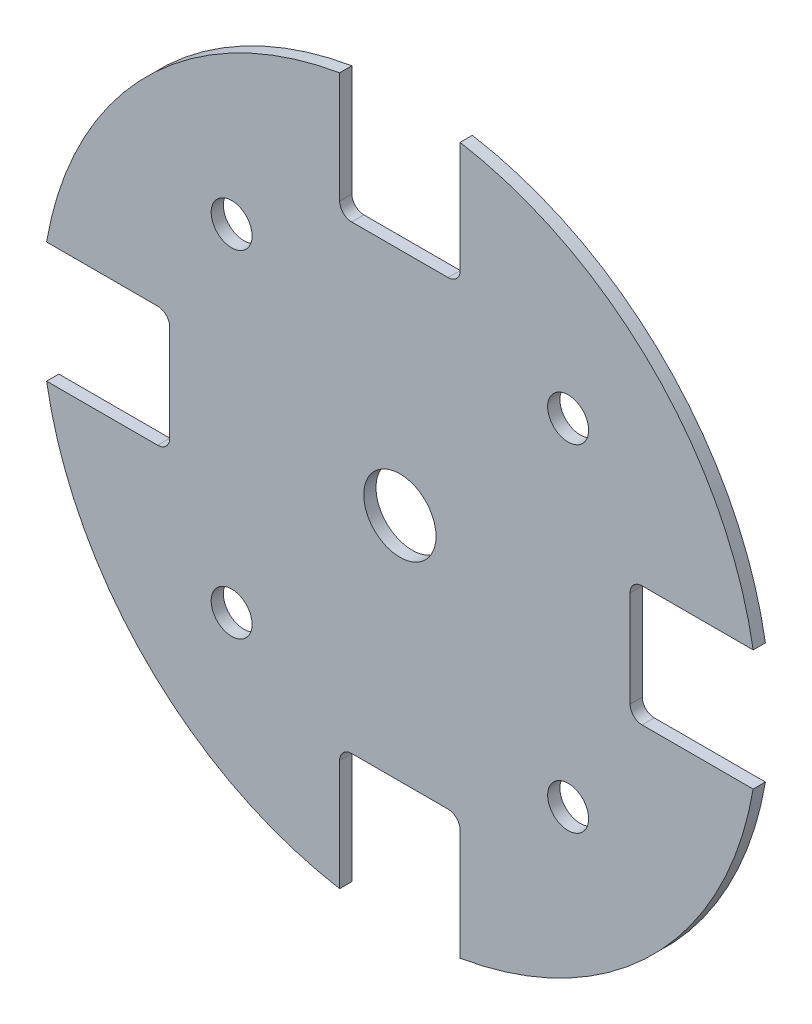
ISO-10303-21;
HEADER;
FILE_DESCRIPTION(('STEP AP214'),'2;1');
FILE_NAME('part.step','',(''),(''),'','','');
FILE_SCHEMA(('AUTOMOTIVE_DESIGN { 1 0 10303 214 1 1 1 1 }'));
ENDSEC;
DATA;
#1=APPLICATION_CONTEXT('core data for automotive mechanical design processes');
#2=APPLICATION_PROTOCOL_DEFINITION('international standard','automotive_design',2000,#1);
#3=PRODUCT_CONTEXT('',#1,'mechanical');
#4=PRODUCT('Part','Part','',(#3));
#5=PRODUCT_RELATED_PRODUCT_CATEGORY('part','',(#4));
#6=PRODUCT_DEFINITION_FORMATION('','',#4);
#7=PRODUCT_DEFINITION_CONTEXT('part definition',#1,'design');
#8=PRODUCT_DEFINITION('design','',#6,#7);
#9=PRODUCT_DEFINITION_SHAPE('','',#8);
#10=(LENGTH_UNIT() NAMED_UNIT(*) SI_UNIT(.MILLI.,.METRE.));
#11=(NAMED_UNIT(*) PLANE_ANGLE_UNIT() SI_UNIT($,.RADIAN.));
#12=(NAMED_UNIT(*) SI_UNIT($,.STERADIAN.) SOLID_ANGLE_UNIT());
#13=UNCERTAINTY_MEASURE_WITH_UNIT(LENGTH_MEASURE(1.E-05),#10,'distance_accuracy_value','');
#14=(GEOMETRIC_REPRESENTATION_CONTEXT(3) GLOBAL_UNCERTAINTY_ASSIGNED_CONTEXT((#13)) GLOBAL_UNIT_ASSIGNED_CONTEXT((#10,
#11,#12)) REPRESENTATION_CONTEXT('',''));
#15=CARTESIAN_POINT('',(0.,0.,0.));
#16=DIRECTION('',(0.,0.,1.));
#17=DIRECTION('',(1.,0.,0.));
#18=AXIS2_PLACEMENT_3D('',#15,#16,#17);
#19=CARTESIAN_POINT('',(20.1066088042855,4.,1.016));
#20=DIRECTION('',(0.,0.,1.));
#21=DIRECTION('',(1.,0.,0.));
#22=AXIS2_PLACEMENT_3D('',#19,#20,#21);
#23=PLANE('',#22);
#24=CARTESIAN_POINT('',(-13.9653589284344,13.9653589284342,1.016));
#25=DIRECTION('',(0.,0.,1.));
#26=DIRECTION('',(1.,0.,0.));
#27=AXIS2_PLACEMENT_3D('',#24,#25,#26);
#28=CIRCLE('',#27,1.7);
#29=CARTESIAN_POINT('',(-12.2653589284344,13.9653589284342,1.016));
#30=VERTEX_POINT('',#29);
#31=EDGE_CURVE('E457',#30,#30,#28,.T.);
#32=ORIENTED_EDGE('',*,*,#31,.F.);
#33=EDGE_LOOP('',(#32));
#34=FACE_BOUND('',#33,.T.);
#35=CARTESIAN_POINT('',(13.9653589284344,-13.9653589284345,1.016));
#36=DIRECTION('',(0.,0.,1.));
#37=DIRECTION('',(1.,0.,0.));
#38=AXIS2_PLACEMENT_3D('',#35,#36,#37);
#39=CIRCLE('',#38,1.7);
#40=CARTESIAN_POINT('',(15.6653589284344,-13.9653589284345,1.016));
#41=VERTEX_POINT('',#40);
#42=EDGE_CURVE('E469',#41,#41,#39,.T.);
#43=ORIENTED_EDGE('',*,*,#42,.F.);
#44=EDGE_LOOP('',(#43));
#45=FACE_BOUND('',#44,.T.);
#46=CARTESIAN_POINT('',(20.1066088042855,4.,1.016));
#47=DIRECTION('',(0.,0.,-1.));
#48=DIRECTION('',(1.,0.,0.));
#49=AXIS2_PLACEMENT_3D('',#46,#47,#48);
#50=CIRCLE('',#49,1.);
#51=CARTESIAN_POINT('',(19.1066088042855,4.,1.016));
#52=VERTEX_POINT('',#51);
#53=CARTESIAN_POINT('',(20.1066088042855,5.,1.016));
#54=VERTEX_POINT('',#53);
#55=EDGE_CURVE('E279',#52,#54,#50,.T.);
#56=ORIENTED_EDGE('',*,*,#55,.T.);
#57=DIRECTION('',(1.,0.,0.));
#58=VECTOR('',#57,1.);
#59=CARTESIAN_POINT('',(29.3268221940257,5.,1.016));
#60=LINE('',#59,#58);
#61=CARTESIAN_POINT('',(29.3268221940257,5.,1.016));
#62=VERTEX_POINT('',#61);
#63=EDGE_CURVE('E147',#54,#62,#60,.T.);
#64=ORIENTED_EDGE('',*,*,#63,.T.);
#65=CARTESIAN_POINT('',(0.,0.,1.016));
#66=DIRECTION('',(0.,0.,1.));
#67=DIRECTION('',(1.,0.,0.));
#68=AXIS2_PLACEMENT_3D('',#65,#66,#67);
#69=CIRCLE('',#68,29.75);
#70=CARTESIAN_POINT('',(4.99999999999907,29.3268221940259,1.016));
#71=VERTEX_POINT('',#70);
#72=EDGE_CURVE('E342',#62,#71,#69,.T.);
#73=ORIENTED_EDGE('',*,*,#72,.T.);
#74=DIRECTION('',(0.,-1.,0.));
#75=VECTOR('',#74,1.);
#76=CARTESIAN_POINT('',(4.99999999999907,29.3268221940259,1.016));
#77=LINE('',#76,#75);
#78=CARTESIAN_POINT('',(4.99999999999936,20.1066088042857,1.016));
#79=VERTEX_POINT('',#78);
#80=EDGE_CURVE('E361',#71,#79,#77,.T.);
#81=ORIENTED_EDGE('',*,*,#80,.T.);
#82=CARTESIAN_POINT('',(3.99999999999936,20.1066088042856,1.016));
#83=DIRECTION('',(0.,0.,-1.));
#84=DIRECTION('',(-1.,0.,0.));
#85=AXIS2_PLACEMENT_3D('',#82,#83,#84);
#86=CIRCLE('',#85,1.);
#87=CARTESIAN_POINT('',(3.99999999999939,19.1066088042856,1.016));
#88=VERTEX_POINT('',#87);
#89=EDGE_CURVE('E358',#79,#88,#86,.T.);
#90=ORIENTED_EDGE('',*,*,#89,.T.);
#91=DIRECTION('',(-1.,0.,0.));
#92=VECTOR('',#91,1.);
#93=CARTESIAN_POINT('',(3.99999999999939,19.1066088042856,1.016));
#94=LINE('',#93,#92);
#95=CARTESIAN_POINT('',(-4.00000000000061,19.1066088042854,1.016));
#96=VERTEX_POINT('',#95);
#97=EDGE_CURVE('E360',#88,#96,#94,.T.);
#98=ORIENTED_EDGE('',*,*,#97,.T.);
#99=CARTESIAN_POINT('',(-4.00000000000064,20.1066088042854,1.016));
#100=DIRECTION('',(0.,0.,-1.));
#101=DIRECTION('',(1.,0.,0.));
#102=AXIS2_PLACEMENT_3D('',#99,#100,#101);
#103=CIRCLE('',#102,1.);
#104=CARTESIAN_POINT('',(-5.00000000000064,20.1066088042853,1.016));
#105=VERTEX_POINT('',#104);
#106=EDGE_CURVE('E363',#96,#105,#103,.T.);
#107=ORIENTED_EDGE('',*,*,#106,.T.);
#108=DIRECTION('',(0.,1.,0.));
#109=VECTOR('',#108,1.);
#110=CARTESIAN_POINT('',(-5.00000000000093,29.3268221940256,1.016));
#111=LINE('',#110,#109);
#112=CARTESIAN_POINT('',(-5.00000000000093,29.3268221940256,1.016));
#113=VERTEX_POINT('',#112);
#114=EDGE_CURVE('E369',#105,#113,#111,.T.);
#115=ORIENTED_EDGE('',*,*,#114,.T.);
#116=CARTESIAN_POINT('',(0.,0.,1.016));
#117=DIRECTION('',(0.,0.,1.));
#118=DIRECTION('',(1.,0.,0.));
#119=AXIS2_PLACEMENT_3D('',#116,#117,#118);
#120=CIRCLE('',#119,29.75);
#121=CARTESIAN_POINT('',(-29.3268221940257,4.99999999999999,1.016));
#122=VERTEX_POINT('',#121);
#123=EDGE_CURVE('E371',#113,#122,#120,.T.);
#124=ORIENTED_EDGE('',*,*,#123,.T.);
#125=DIRECTION('',(1.,0.,0.));
#126=VECTOR('',#125,1.);
#127=CARTESIAN_POINT('',(-29.3268221940257,5.,1.016));
#128=LINE('',#127,#126);
#129=CARTESIAN_POINT('',(-20.1066088042855,5.,1.016));
#130=VERTEX_POINT('',#129);
#131=EDGE_CURVE('E373',#122,#130,#128,.T.);
#132=ORIENTED_EDGE('',*,*,#131,.T.);
#133=CARTESIAN_POINT('',(-20.1066088042855,4.,1.016));
#134=DIRECTION('',(0.,0.,-1.));
#135=DIRECTION('',(-1.,0.,0.));
#136=AXIS2_PLACEMENT_3D('',#133,#134,#135);
#137=CIRCLE('',#136,1.);
#138=CARTESIAN_POINT('',(-19.1066088042855,4.,1.016));
#139=VERTEX_POINT('',#138);
#140=EDGE_CURVE('E375',#130,#139,#137,.T.);
#141=ORIENTED_EDGE('',*,*,#140,.T.);
#142=DIRECTION('',(0.,-1.,0.));
#143=VECTOR('',#142,1.);
#144=CARTESIAN_POINT('',(-19.1066088042855,4.,1.016));
#145=LINE('',#144,#143);
#146=CARTESIAN_POINT('',(-19.1066088042855,-4.,1.016));
#147=VERTEX_POINT('',#146);
#148=EDGE_CURVE('E377',#139,#147,#145,.T.);
#149=ORIENTED_EDGE('',*,*,#148,.T.);
#150=CARTESIAN_POINT('',(-20.1066088042855,-4.,1.016));
#151=DIRECTION('',(0.,0.,-1.));
#152=DIRECTION('',(1.,0.,0.));
#153=AXIS2_PLACEMENT_3D('',#150,#151,#152);
#154=CIRCLE('',#153,1.);
#155=CARTESIAN_POINT('',(-20.1066088042855,-5.,1.016));
#156=VERTEX_POINT('',#155);
#157=EDGE_CURVE('E379',#147,#156,#154,.T.);
#158=ORIENTED_EDGE('',*,*,#157,.T.);
#159=DIRECTION('',(-1.,0.,0.));
#160=VECTOR('',#159,1.);
#161=CARTESIAN_POINT('',(-29.3268221940257,-5.,1.016));
#162=LINE('',#161,#160);
#163=CARTESIAN_POINT('',(-29.3268221940257,-5.,1.016));
#164=VERTEX_POINT('',#163);
#165=EDGE_CURVE('E381',#156,#164,#162,.T.);
#166=ORIENTED_EDGE('',*,*,#165,.T.);
#167=CARTESIAN_POINT('',(0.,0.,1.016));
#168=DIRECTION('',(0.,0.,1.));
#169=DIRECTION('',(1.,0.,0.));
#170=AXIS2_PLACEMENT_3D('',#167,#168,#169);
#171=CIRCLE('',#170,29.75);
#172=CARTESIAN_POINT('',(-4.99999999999907,-29.3268221940259,1.016));
#173=VERTEX_POINT('',#172);
#174=EDGE_CURVE('E383',#164,#173,#171,.T.);
#175=ORIENTED_EDGE('',*,*,#174,.T.);
#176=DIRECTION('',(0.,1.,0.));
#177=VECTOR('',#176,1.);
#178=CARTESIAN_POINT('',(-4.99999999999907,-29.3268221940259,1.016));
#179=LINE('',#178,#177);
#180=CARTESIAN_POINT('',(-4.99999999999936,-20.1066088042857,1.016));
#181=VERTEX_POINT('',#180);
#182=EDGE_CURVE('E385',#173,#181,#179,.T.);
#183=ORIENTED_EDGE('',*,*,#182,.T.);
#184=CARTESIAN_POINT('',(-3.99999999999936,-20.1066088042856,1.016));
#185=DIRECTION('',(0.,0.,-1.));
#186=DIRECTION('',(-1.,0.,0.));
#187=AXIS2_PLACEMENT_3D('',#184,#185,#186);
#188=CIRCLE('',#187,1.);
#189=CARTESIAN_POINT('',(-3.99999999999939,-19.1066088042856,1.016));
#190=VERTEX_POINT('',#189);
#191=EDGE_CURVE('E387',#181,#190,#188,.T.);
#192=ORIENTED_EDGE('',*,*,#191,.T.);
#193=DIRECTION('',(1.,0.,0.));
#194=VECTOR('',#193,1.);
#195=CARTESIAN_POINT('',(4.00000000000061,-19.1066088042854,1.016));
#196=LINE('',#195,#194);
#197=CARTESIAN_POINT('',(4.00000000000061,-19.1066088042854,1.016));
#198=VERTEX_POINT('',#197);
#199=EDGE_CURVE('E389',#190,#198,#196,.T.);
#200=ORIENTED_EDGE('',*,*,#199,.T.);
#201=CARTESIAN_POINT('',(4.00000000000064,-20.1066088042854,1.016));
#202=DIRECTION('',(0.,0.,-1.));
#203=DIRECTION('',(1.,0.,0.));
#204=AXIS2_PLACEMENT_3D('',#201,#202,#203);
#205=CIRCLE('',#204,1.);
#206=CARTESIAN_POINT('',(5.00000000000064,-20.1066088042853,1.016));
#207=VERTEX_POINT('',#206);
#208=EDGE_CURVE('E391',#198,#207,#205,.T.);
#209=ORIENTED_EDGE('',*,*,#208,.T.);
#210=DIRECTION('',(0.,-1.,0.));
#211=VECTOR('',#210,1.);
#212=CARTESIAN_POINT('',(5.00000000000093,-29.3268221940256,1.016));
#213=LINE('',#212,#211);
#214=CARTESIAN_POINT('',(5.00000000000093,-29.3268221940256,1.016));
#215=VERTEX_POINT('',#214);
#216=EDGE_CURVE('E393',#207,#215,#213,.T.);
#217=ORIENTED_EDGE('',*,*,#216,.T.);
#218=CARTESIAN_POINT('',(0.,0.,1.016));
#219=DIRECTION('',(0.,0.,1.));
#220=DIRECTION('',(1.,0.,0.));
#221=AXIS2_PLACEMENT_3D('',#218,#219,#220);
#222=CIRCLE('',#221,29.75);
#223=CARTESIAN_POINT('',(29.3268221940257,-5.00000000000001,1.016));
#224=VERTEX_POINT('',#223);
#225=EDGE_CURVE('E214',#215,#224,#222,.T.);
#226=ORIENTED_EDGE('',*,*,#225,.T.);
#227=DIRECTION('',(-1.,0.,0.));
#228=VECTOR('',#227,1.);
#229=CARTESIAN_POINT('',(29.3268221940257,-5.,1.016));
#230=LINE('',#229,#228);
#231=CARTESIAN_POINT('',(20.1066088042855,-5.,1.016));
#232=VERTEX_POINT('',#231);
#233=EDGE_CURVE('E208',#224,#232,#230,.T.);
#234=ORIENTED_EDGE('',*,*,#233,.T.);
#235=CARTESIAN_POINT('',(20.1066088042855,-4.,1.016));
#236=DIRECTION('',(0.,0.,-1.));
#237=DIRECTION('',(-1.,0.,0.));
#238=AXIS2_PLACEMENT_3D('',#235,#236,#237);
#239=CIRCLE('',#238,1.);
#240=CARTESIAN_POINT('',(19.1066088042855,-4.,1.016));
#241=VERTEX_POINT('',#240);
#242=EDGE_CURVE('E212',#232,#241,#239,.T.);
#243=ORIENTED_EDGE('',*,*,#242,.T.);
#244=DIRECTION('',(0.,1.,0.));
#245=VECTOR('',#244,1.);
#246=CARTESIAN_POINT('',(19.1066088042855,4.,1.016));
#247=LINE('',#246,#245);
#248=EDGE_CURVE('E56',#241,#52,#247,.T.);
#249=ORIENTED_EDGE('',*,*,#248,.T.);
#250=EDGE_LOOP('',(#56,#64,#73,#81,#90,#98,#107,#115,#124,#132,#141,#149,#158,#166,#175,#183,
#192,#200,#209,#217,#226,#234,#243,#249));
#251=FACE_BOUND('',#250,.T.);
#252=CARTESIAN_POINT('',(13.9653589284344,13.9653589284342,1.016));
#253=DIRECTION('',(0.,0.,1.));
#254=DIRECTION('',(1.,0.,0.));
#255=AXIS2_PLACEMENT_3D('',#252,#253,#254);
#256=CIRCLE('',#255,1.7);
#257=CARTESIAN_POINT('',(15.6653589284344,13.9653589284342,1.016));
#258=VERTEX_POINT('',#257);
#259=EDGE_CURVE('E236',#258,#258,#256,.T.);
#260=ORIENTED_EDGE('',*,*,#259,.F.);
#261=EDGE_LOOP('',(#260));
#262=FACE_BOUND('',#261,.T.);
#263=CARTESIAN_POINT('',(-13.9653589284344,-13.9653589284345,1.016));
#264=DIRECTION('',(0.,0.,1.));
#265=DIRECTION('',(1.,0.,0.));
#266=AXIS2_PLACEMENT_3D('',#263,#264,#265);
#267=CIRCLE('',#266,1.7);
#268=CARTESIAN_POINT('',(-12.2653589284344,-13.9653589284345,1.016));
#269=VERTEX_POINT('',#268);
#270=EDGE_CURVE('E463',#269,#269,#267,.T.);
#271=ORIENTED_EDGE('',*,*,#270,.F.);
#272=EDGE_LOOP('',(#271));
#273=FACE_BOUND('',#272,.T.);
#274=CARTESIAN_POINT('',(0.,0.,1.016));
#275=DIRECTION('',(0.,0.,1.));
#276=DIRECTION('',(1.,0.,0.));
#277=AXIS2_PLACEMENT_3D('',#274,#275,#276);
#278=CIRCLE('',#277,3.);
#279=CARTESIAN_POINT('',(3.,0.,1.016));
#280=VERTEX_POINT('',#279);
#281=EDGE_CURVE('E448',#280,#280,#278,.T.);
#282=ORIENTED_EDGE('',*,*,#281,.F.);
#283=EDGE_LOOP('',(#282));
#284=FACE_BOUND('',#283,.T.);
#285=ADVANCED_FACE('F39',(#34,#45,#251,#262,#273,#284),#23,.T.);
#286=CARTESIAN_POINT('',(20.1066088042855,4.,0.));
#287=DIRECTION('',(0.,0.,1.));
#288=DIRECTION('',(1.,0.,0.));
#289=AXIS2_PLACEMENT_3D('',#286,#287,#288);
#290=PLANE('',#289);
#291=CARTESIAN_POINT('',(20.1066088042855,4.,0.));
#292=DIRECTION('',(0.,0.,-1.));
#293=DIRECTION('',(1.,0.,0.));
#294=AXIS2_PLACEMENT_3D('',#291,#292,#293);
#295=CIRCLE('',#294,1.);
#296=CARTESIAN_POINT('',(19.1066088042855,4.,0.));
#297=VERTEX_POINT('',#296);
#298=CARTESIAN_POINT('',(20.1066088042855,5.,0.));
#299=VERTEX_POINT('',#298);
#300=EDGE_CURVE('E232',#297,#299,#295,.T.);
#301=ORIENTED_EDGE('',*,*,#300,.F.);
#302=DIRECTION('',(0.,1.,0.));
#303=VECTOR('',#302,1.);
#304=CARTESIAN_POINT('',(19.1066088042855,4.,0.));
#305=LINE('',#304,#303);
#306=CARTESIAN_POINT('',(19.1066088042855,-4.,0.));
#307=VERTEX_POINT('',#306);
#308=EDGE_CURVE('E139',#307,#297,#305,.T.);
#309=ORIENTED_EDGE('',*,*,#308,.F.);
#310=CARTESIAN_POINT('',(20.1066088042855,-4.,0.));
#311=DIRECTION('',(0.,0.,-1.));
#312=DIRECTION('',(-1.,0.,0.));
#313=AXIS2_PLACEMENT_3D('',#310,#311,#312);
#314=CIRCLE('',#313,1.);
#315=CARTESIAN_POINT('',(20.1066088042855,-5.,0.));
#316=VERTEX_POINT('',#315);
#317=EDGE_CURVE('E133',#316,#307,#314,.T.);
#318=ORIENTED_EDGE('',*,*,#317,.F.);
#319=DIRECTION('',(-1.,0.,0.));
#320=VECTOR('',#319,1.);
#321=CARTESIAN_POINT('',(29.3268221940257,-5.,0.));
#322=LINE('',#321,#320);
#323=CARTESIAN_POINT('',(29.3268221940257,-5.00000000000001,0.));
#324=VERTEX_POINT('',#323);
#325=EDGE_CURVE('E222',#324,#316,#322,.T.);
#326=ORIENTED_EDGE('',*,*,#325,.F.);
#327=CARTESIAN_POINT('',(0.,0.,0.));
#328=DIRECTION('',(0.,0.,1.));
#329=DIRECTION('',(1.,0.,0.));
#330=AXIS2_PLACEMENT_3D('',#327,#328,#329);
#331=CIRCLE('',#330,29.75);
#332=CARTESIAN_POINT('',(5.00000000000093,-29.3268221940256,0.));
#333=VERTEX_POINT('',#332);
#334=EDGE_CURVE('E274',#333,#324,#331,.T.);
#335=ORIENTED_EDGE('',*,*,#334,.F.);
#336=DIRECTION('',(0.,-1.,0.));
#337=VECTOR('',#336,1.);
#338=CARTESIAN_POINT('',(5.00000000000093,-29.3268221940256,0.));
#339=LINE('',#338,#337);
#340=CARTESIAN_POINT('',(5.00000000000064,-20.1066088042853,0.));
#341=VERTEX_POINT('',#340);
#342=EDGE_CURVE('E272',#341,#333,#339,.T.);
#343=ORIENTED_EDGE('',*,*,#342,.F.);
#344=CARTESIAN_POINT('',(4.00000000000064,-20.1066088042854,0.));
#345=DIRECTION('',(0.,0.,-1.));
#346=DIRECTION('',(1.,0.,0.));
#347=AXIS2_PLACEMENT_3D('',#344,#345,#346);
#348=CIRCLE('',#347,1.);
#349=CARTESIAN_POINT('',(4.00000000000061,-19.1066088042854,0.));
#350=VERTEX_POINT('',#349);
#351=EDGE_CURVE('E270',#350,#341,#348,.T.);
#352=ORIENTED_EDGE('',*,*,#351,.F.);
#353=DIRECTION('',(1.,0.,0.));
#354=VECTOR('',#353,1.);
#355=CARTESIAN_POINT('',(4.00000000000061,-19.1066088042854,0.));
#356=LINE('',#355,#354);
#357=CARTESIAN_POINT('',(-3.99999999999939,-19.1066088042856,0.));
#358=VERTEX_POINT('',#357);
#359=EDGE_CURVE('E268',#358,#350,#356,.T.);
#360=ORIENTED_EDGE('',*,*,#359,.F.);
#361=CARTESIAN_POINT('',(-3.99999999999936,-20.1066088042856,0.));
#362=DIRECTION('',(0.,0.,-1.));
#363=DIRECTION('',(-1.,0.,0.));
#364=AXIS2_PLACEMENT_3D('',#361,#362,#363);
#365=CIRCLE('',#364,1.);
#366=CARTESIAN_POINT('',(-4.99999999999936,-20.1066088042857,0.));
#367=VERTEX_POINT('',#366);
#368=EDGE_CURVE('E266',#367,#358,#365,.T.);
#369=ORIENTED_EDGE('',*,*,#368,.F.);
#370=DIRECTION('',(0.,1.,0.));
#371=VECTOR('',#370,1.);
#372=CARTESIAN_POINT('',(-4.99999999999907,-29.3268221940259,0.));
#373=LINE('',#372,#371);
#374=CARTESIAN_POINT('',(-4.99999999999907,-29.3268221940259,0.));
#375=VERTEX_POINT('',#374);
#376=EDGE_CURVE('E264',#375,#367,#373,.T.);
#377=ORIENTED_EDGE('',*,*,#376,.F.);
#378=CARTESIAN_POINT('',(0.,0.,0.));
#379=DIRECTION('',(0.,0.,1.));
#380=DIRECTION('',(1.,0.,0.));
#381=AXIS2_PLACEMENT_3D('',#378,#379,#380);
#382=CIRCLE('',#381,29.75);
#383=CARTESIAN_POINT('',(-29.3268221940257,-5.,0.));
#384=VERTEX_POINT('',#383);
#385=EDGE_CURVE('E262',#384,#375,#382,.T.);
#386=ORIENTED_EDGE('',*,*,#385,.F.);
#387=DIRECTION('',(-1.,0.,0.));
#388=VECTOR('',#387,1.);
#389=CARTESIAN_POINT('',(-29.3268221940257,-5.,0.));
#390=LINE('',#389,#388);
#391=CARTESIAN_POINT('',(-20.1066088042855,-5.,0.));
#392=VERTEX_POINT('',#391);
#393=EDGE_CURVE('E260',#392,#384,#390,.T.);
#394=ORIENTED_EDGE('',*,*,#393,.F.);
#395=CARTESIAN_POINT('',(-20.1066088042855,-4.,0.));
#396=DIRECTION('',(0.,0.,-1.));
#397=DIRECTION('',(1.,0.,0.));
#398=AXIS2_PLACEMENT_3D('',#395,#396,#397);
#399=CIRCLE('',#398,1.);
#400=CARTESIAN_POINT('',(-19.1066088042855,-4.,0.));
#401=VERTEX_POINT('',#400);
#402=EDGE_CURVE('E258',#401,#392,#399,.T.);
#403=ORIENTED_EDGE('',*,*,#402,.F.);
#404=DIRECTION('',(0.,-1.,0.));
#405=VECTOR('',#404,1.);
#406=CARTESIAN_POINT('',(-19.1066088042855,4.,0.));
#407=LINE('',#406,#405);
#408=CARTESIAN_POINT('',(-19.1066088042855,4.,0.));
#409=VERTEX_POINT('',#408);
#410=EDGE_CURVE('E256',#409,#401,#407,.T.);
#411=ORIENTED_EDGE('',*,*,#410,.F.);
#412=CARTESIAN_POINT('',(-20.1066088042855,4.,0.));
#413=DIRECTION('',(0.,0.,-1.));
#414=DIRECTION('',(-1.,0.,0.));
#415=AXIS2_PLACEMENT_3D('',#412,#413,#414);
#416=CIRCLE('',#415,1.);
#417=CARTESIAN_POINT('',(-20.1066088042855,5.,0.));
#418=VERTEX_POINT('',#417);
#419=EDGE_CURVE('E254',#418,#409,#416,.T.);
#420=ORIENTED_EDGE('',*,*,#419,.F.);
#421=DIRECTION('',(1.,0.,0.));
#422=VECTOR('',#421,1.);
#423=CARTESIAN_POINT('',(-29.3268221940257,5.,0.));
#424=LINE('',#423,#422);
#425=CARTESIAN_POINT('',(-29.3268221940257,4.99999999999999,0.));
#426=VERTEX_POINT('',#425);
#427=EDGE_CURVE('E252',#426,#418,#424,.T.);
#428=ORIENTED_EDGE('',*,*,#427,.F.);
#429=CARTESIAN_POINT('',(0.,0.,0.));
#430=DIRECTION('',(0.,0.,1.));
#431=DIRECTION('',(1.,0.,0.));
#432=AXIS2_PLACEMENT_3D('',#429,#430,#431);
#433=CIRCLE('',#432,29.75);
#434=CARTESIAN_POINT('',(-5.00000000000093,29.3268221940256,0.));
#435=VERTEX_POINT('',#434);
#436=EDGE_CURVE('E250',#435,#426,#433,.T.);
#437=ORIENTED_EDGE('',*,*,#436,.F.);
#438=DIRECTION('',(0.,1.,0.));
#439=VECTOR('',#438,1.);
#440=CARTESIAN_POINT('',(-5.00000000000093,29.3268221940256,0.));
#441=LINE('',#440,#439);
#442=CARTESIAN_POINT('',(-5.00000000000064,20.1066088042853,0.));
#443=VERTEX_POINT('',#442);
#444=EDGE_CURVE('E248',#443,#435,#441,.T.);
#445=ORIENTED_EDGE('',*,*,#444,.F.);
#446=CARTESIAN_POINT('',(-4.00000000000064,20.1066088042854,0.));
#447=DIRECTION('',(0.,0.,-1.));
#448=DIRECTION('',(1.,0.,0.));
#449=AXIS2_PLACEMENT_3D('',#446,#447,#448);
#450=CIRCLE('',#449,1.);
#451=CARTESIAN_POINT('',(-4.00000000000061,19.1066088042854,0.));
#452=VERTEX_POINT('',#451);
#453=EDGE_CURVE('E246',#452,#443,#450,.T.);
#454=ORIENTED_EDGE('',*,*,#453,.F.);
#455=DIRECTION('',(-1.,0.,0.));
#456=VECTOR('',#455,1.);
#457=CARTESIAN_POINT('',(3.99999999999939,19.1066088042856,0.));
#458=LINE('',#457,#456);
#459=CARTESIAN_POINT('',(3.99999999999939,19.1066088042856,0.));
#460=VERTEX_POINT('',#459);
#461=EDGE_CURVE('E244',#460,#452,#458,.T.);
#462=ORIENTED_EDGE('',*,*,#461,.F.);
#463=CARTESIAN_POINT('',(3.99999999999936,20.1066088042856,0.));
#464=DIRECTION('',(0.,0.,-1.));
#465=DIRECTION('',(-1.,0.,0.));
#466=AXIS2_PLACEMENT_3D('',#463,#464,#465);
#467=CIRCLE('',#466,1.);
#468=CARTESIAN_POINT('',(4.99999999999936,20.1066088042857,0.));
#469=VERTEX_POINT('',#468);
#470=EDGE_CURVE('E242',#469,#460,#467,.T.);
#471=ORIENTED_EDGE('',*,*,#470,.F.);
#472=DIRECTION('',(0.,-1.,0.));
#473=VECTOR('',#472,1.);
#474=CARTESIAN_POINT('',(4.99999999999907,29.3268221940259,0.));
#475=LINE('',#474,#473);
#476=CARTESIAN_POINT('',(4.99999999999907,29.3268221940259,0.));
#477=VERTEX_POINT('',#476);
#478=EDGE_CURVE('E240',#477,#469,#475,.T.);
#479=ORIENTED_EDGE('',*,*,#478,.F.);
#480=CARTESIAN_POINT('',(0.,0.,0.));
#481=DIRECTION('',(0.,0.,1.));
#482=DIRECTION('',(1.,0.,0.));
#483=AXIS2_PLACEMENT_3D('',#480,#481,#482);
#484=CIRCLE('',#483,29.75);
#485=CARTESIAN_POINT('',(29.3268221940257,5.,0.));
#486=VERTEX_POINT('',#485);
#487=EDGE_CURVE('E238',#486,#477,#484,.T.);
#488=ORIENTED_EDGE('',*,*,#487,.F.);
#489=DIRECTION('',(1.,0.,0.));
#490=VECTOR('',#489,1.);
#491=CARTESIAN_POINT('',(29.3268221940257,5.,0.));
#492=LINE('',#491,#490);
#493=EDGE_CURVE('E235',#299,#486,#492,.T.);
#494=ORIENTED_EDGE('',*,*,#493,.F.);
#495=EDGE_LOOP('',(#301,#309,#318,#326,#335,#343,#352,#360,#369,#377,#386,#394,#403,#411,#420,
#428,#437,#445,#454,#462,#471,#479,#488,#494));
#496=FACE_BOUND('',#495,.T.);
#497=CARTESIAN_POINT('',(13.9653589284344,13.9653589284342,0.));
#498=DIRECTION('',(0.,0.,1.));
#499=DIRECTION('',(1.,0.,0.));
#500=AXIS2_PLACEMENT_3D('',#497,#498,#499);
#501=CIRCLE('',#500,1.7);
#502=CARTESIAN_POINT('',(15.6653589284344,13.9653589284342,0.));
#503=VERTEX_POINT('',#502);
#504=EDGE_CURVE('E472',#503,#503,#501,.T.);
#505=ORIENTED_EDGE('',*,*,#504,.T.);
#506=EDGE_LOOP('',(#505));
#507=FACE_BOUND('',#506,.T.);
#508=CARTESIAN_POINT('',(13.9653589284344,-13.9653589284345,0.));
#509=DIRECTION('',(0.,0.,1.));
#510=DIRECTION('',(1.,0.,0.));
#511=AXIS2_PLACEMENT_3D('',#508,#509,#510);
#512=CIRCLE('',#511,1.7);
#513=CARTESIAN_POINT('',(15.6653589284344,-13.9653589284345,0.));
#514=VERTEX_POINT('',#513);
#515=EDGE_CURVE('E466',#514,#514,#512,.T.);
#516=ORIENTED_EDGE('',*,*,#515,.T.);
#517=EDGE_LOOP('',(#516));
#518=FACE_BOUND('',#517,.T.);
#519=CARTESIAN_POINT('',(-13.9653589284344,-13.9653589284345,0.));
#520=DIRECTION('',(0.,0.,1.));
#521=DIRECTION('',(1.,0.,0.));
#522=AXIS2_PLACEMENT_3D('',#519,#520,#521);
#523=CIRCLE('',#522,1.7);
#524=CARTESIAN_POINT('',(-12.2653589284344,-13.9653589284345,0.));
#525=VERTEX_POINT('',#524);
#526=EDGE_CURVE('E460',#525,#525,#523,.T.);
#527=ORIENTED_EDGE('',*,*,#526,.T.);
#528=EDGE_LOOP('',(#527));
#529=FACE_BOUND('',#528,.T.);
#530=CARTESIAN_POINT('',(-13.9653589284344,13.9653589284342,0.));
#531=DIRECTION('',(0.,0.,1.));
#532=DIRECTION('',(1.,0.,0.));
#533=AXIS2_PLACEMENT_3D('',#530,#531,#532);
#534=CIRCLE('',#533,1.7);
#535=CARTESIAN_POINT('',(-12.2653589284344,13.9653589284342,0.));
#536=VERTEX_POINT('',#535);
#537=EDGE_CURVE('E454',#536,#536,#534,.T.);
#538=ORIENTED_EDGE('',*,*,#537,.T.);
#539=EDGE_LOOP('',(#538));
#540=FACE_BOUND('',#539,.T.);
#541=CARTESIAN_POINT('',(0.,0.,0.));
#542=DIRECTION('',(0.,0.,1.));
#543=DIRECTION('',(1.,0.,0.));
#544=AXIS2_PLACEMENT_3D('',#541,#542,#543);
#545=CIRCLE('',#544,3.);
#546=CARTESIAN_POINT('',(3.,0.,0.));
#547=VERTEX_POINT('',#546);
#548=EDGE_CURVE('E451',#547,#547,#545,.T.);
#549=ORIENTED_EDGE('',*,*,#548,.T.);
#550=EDGE_LOOP('',(#549));
#551=FACE_BOUND('',#550,.T.);
#552=ADVANCED_FACE('F346',(#496,#507,#518,#529,#540,#551),#290,.F.);
#553=CARTESIAN_POINT('',(20.1066088042855,4.,1.016));
#554=DIRECTION('',(0.,0.,-1.));
#555=DIRECTION('',(-1.,0.,0.));
#556=AXIS2_PLACEMENT_3D('',#553,#554,#555);
#557=CYLINDRICAL_SURFACE('',#556,1.);
#558=ORIENTED_EDGE('',*,*,#300,.T.);
#559=DIRECTION('',(0.,0.,-1.));
#560=VECTOR('',#559,1.);
#561=CARTESIAN_POINT('',(20.1066088042855,5.,1.016));
#562=LINE('',#561,#560);
#563=EDGE_CURVE('E11',#54,#299,#562,.T.);
#564=ORIENTED_EDGE('',*,*,#563,.F.);
#565=ORIENTED_EDGE('',*,*,#55,.F.);
#566=DIRECTION('',(0.,0.,-1.));
#567=VECTOR('',#566,1.);
#568=CARTESIAN_POINT('',(19.1066088042855,4.,1.016));
#569=LINE('',#568,#567);
#570=EDGE_CURVE('E228',#52,#297,#569,.T.);
#571=ORIENTED_EDGE('',*,*,#570,.T.);
#572=EDGE_LOOP('',(#558,#564,#565,#571));
#573=FACE_BOUND('',#572,.T.);
#574=ADVANCED_FACE('F41',(#573),#557,.F.);
#575=CARTESIAN_POINT('',(29.3268221940257,5.,1.016));
#576=DIRECTION('',(0.,1.,0.));
#577=DIRECTION('',(0.,0.,1.));
#578=AXIS2_PLACEMENT_3D('',#575,#576,#577);
#579=PLANE('',#578);
#580=ORIENTED_EDGE('',*,*,#493,.T.);
#581=DIRECTION('',(0.,0.,-1.));
#582=VECTOR('',#581,1.);
#583=CARTESIAN_POINT('',(29.3268221940257,5.,1.016));
#584=LINE('',#583,#582);
#585=EDGE_CURVE('E48',#62,#486,#584,.T.);
#586=ORIENTED_EDGE('',*,*,#585,.F.);
#587=ORIENTED_EDGE('',*,*,#63,.F.);
#588=ORIENTED_EDGE('',*,*,#563,.T.);
#589=EDGE_LOOP('',(#580,#586,#587,#588));
#590=FACE_BOUND('',#589,.T.);
#591=ADVANCED_FACE('F733',(#590),#579,.F.);
#592=CARTESIAN_POINT('',(0.,0.,1.016));
#593=DIRECTION('',(0.,0.,-1.));
#594=DIRECTION('',(-1.,0.,0.));
#595=AXIS2_PLACEMENT_3D('',#592,#593,#594);
#596=CYLINDRICAL_SURFACE('',#595,29.75);
#597=ORIENTED_EDGE('',*,*,#487,.T.);
#598=DIRECTION('',(0.,0.,-1.));
#599=VECTOR('',#598,1.);
#600=CARTESIAN_POINT('',(4.99999999999907,29.3268221940259,1.016));
#601=LINE('',#600,#599);
#602=EDGE_CURVE('E334',#71,#477,#601,.T.);
#603=ORIENTED_EDGE('',*,*,#602,.F.);
#604=ORIENTED_EDGE('',*,*,#72,.F.);
#605=ORIENTED_EDGE('',*,*,#585,.T.);
#606=EDGE_LOOP('',(#597,#603,#604,#605));
#607=FACE_BOUND('',#606,.T.);
#608=ADVANCED_FACE('F340',(#607),#596,.T.);
#609=CARTESIAN_POINT('',(4.99999999999907,29.3268221940259,1.016));
#610=DIRECTION('',(1.,0.,0.));
#611=DIRECTION('',(0.,1.,0.));
#612=AXIS2_PLACEMENT_3D('',#609,#610,#611);
#613=PLANE('',#612);
#614=ORIENTED_EDGE('',*,*,#478,.T.);
#615=DIRECTION('',(0.,0.,-1.));
#616=VECTOR('',#615,1.);
#617=CARTESIAN_POINT('',(4.99999999999936,20.1066088042857,1.016));
#618=LINE('',#617,#616);
#619=EDGE_CURVE('E331',#79,#469,#618,.T.);
#620=ORIENTED_EDGE('',*,*,#619,.F.);
#621=ORIENTED_EDGE('',*,*,#80,.F.);
#622=ORIENTED_EDGE('',*,*,#602,.T.);
#623=EDGE_LOOP('',(#614,#620,#621,#622));
#624=FACE_BOUND('',#623,.T.);
#625=ADVANCED_FACE('F352',(#624),#613,.F.);
#626=CARTESIAN_POINT('',(3.99999999999936,20.1066088042856,1.016));
#627=DIRECTION('',(0.,0.,-1.));
#628=DIRECTION('',(-1.,0.,0.));
#629=AXIS2_PLACEMENT_3D('',#626,#627,#628);
#630=CYLINDRICAL_SURFACE('',#629,1.);
#631=ORIENTED_EDGE('',*,*,#470,.T.);
#632=DIRECTION('',(0.,0.,-1.));
#633=VECTOR('',#632,1.);
#634=CARTESIAN_POINT('',(3.99999999999939,19.1066088042856,1.016));
#635=LINE('',#634,#633);
#636=EDGE_CURVE('E328',#88,#460,#635,.T.);
#637=ORIENTED_EDGE('',*,*,#636,.F.);
#638=ORIENTED_EDGE('',*,*,#89,.F.);
#639=ORIENTED_EDGE('',*,*,#619,.T.);
#640=EDGE_LOOP('',(#631,#637,#638,#639));
#641=FACE_BOUND('',#640,.T.);
#642=ADVANCED_FACE('F356',(#641),#630,.F.);
#643=CARTESIAN_POINT('',(3.99999999999939,19.1066088042856,1.016));
#644=DIRECTION('',(0.,-1.,0.));
#645=DIRECTION('',(1.,0.,0.));
#646=AXIS2_PLACEMENT_3D('',#643,#644,#645);
#647=PLANE('',#646);
#648=ORIENTED_EDGE('',*,*,#461,.T.);
#649=DIRECTION('',(0.,0.,-1.));
#650=VECTOR('',#649,1.);
#651=CARTESIAN_POINT('',(-4.00000000000061,19.1066088042854,1.016));
#652=LINE('',#651,#650);
#653=EDGE_CURVE('E325',#96,#452,#652,.T.);
#654=ORIENTED_EDGE('',*,*,#653,.F.);
#655=ORIENTED_EDGE('',*,*,#97,.F.);
#656=ORIENTED_EDGE('',*,*,#636,.T.);
#657=EDGE_LOOP('',(#648,#654,#655,#656));
#658=FACE_BOUND('',#657,.T.);
#659=ADVANCED_FACE('F694',(#658),#647,.F.);
#660=CARTESIAN_POINT('',(-4.00000000000064,20.1066088042854,1.016));
#661=DIRECTION('',(0.,0.,-1.));
#662=DIRECTION('',(-1.,0.,0.));
#663=AXIS2_PLACEMENT_3D('',#660,#661,#662);
#664=CYLINDRICAL_SURFACE('',#663,1.);
#665=ORIENTED_EDGE('',*,*,#453,.T.);
#666=DIRECTION('',(0.,0.,-1.));
#667=VECTOR('',#666,1.);
#668=CARTESIAN_POINT('',(-5.00000000000064,20.1066088042853,1.016));
#669=LINE('',#668,#667);
#670=EDGE_CURVE('E322',#105,#443,#669,.T.);
#671=ORIENTED_EDGE('',*,*,#670,.F.);
#672=ORIENTED_EDGE('',*,*,#106,.F.);
#673=ORIENTED_EDGE('',*,*,#653,.T.);
#674=EDGE_LOOP('',(#665,#671,#672,#673));
#675=FACE_BOUND('',#674,.T.);
#676=ADVANCED_FACE('F683',(#675),#664,.F.);
#677=CARTESIAN_POINT('',(-5.00000000000093,29.3268221940256,1.016));
#678=DIRECTION('',(-1.,0.,0.));
#679=DIRECTION('',(0.,-1.,0.));
#680=AXIS2_PLACEMENT_3D('',#677,#678,#679);
#681=PLANE('',#680);
#682=ORIENTED_EDGE('',*,*,#444,.T.);
#683=DIRECTION('',(0.,0.,-1.));
#684=VECTOR('',#683,1.);
#685=CARTESIAN_POINT('',(-5.00000000000093,29.3268221940256,1.016));
#686=LINE('',#685,#684);
#687=EDGE_CURVE('E319',#113,#435,#686,.T.);
#688=ORIENTED_EDGE('',*,*,#687,.F.);
#689=ORIENTED_EDGE('',*,*,#114,.F.);
#690=ORIENTED_EDGE('',*,*,#670,.T.);
#691=EDGE_LOOP('',(#682,#688,#689,#690));
#692=FACE_BOUND('',#691,.T.);
#693=ADVANCED_FACE('F672',(#692),#681,.F.);
#694=CARTESIAN_POINT('',(0.,0.,1.016));
#695=DIRECTION('',(0.,0.,-1.));
#696=DIRECTION('',(-1.,0.,0.));
#697=AXIS2_PLACEMENT_3D('',#694,#695,#696);
#698=CYLINDRICAL_SURFACE('',#697,29.75);
#699=ORIENTED_EDGE('',*,*,#436,.T.);
#700=DIRECTION('',(0.,0.,-1.));
#701=VECTOR('',#700,1.);
#702=CARTESIAN_POINT('',(-29.3268221940257,4.99999999999999,1.016));
#703=LINE('',#702,#701);
#704=EDGE_CURVE('E316',#122,#426,#703,.T.);
#705=ORIENTED_EDGE('',*,*,#704,.F.);
#706=ORIENTED_EDGE('',*,*,#123,.F.);
#707=ORIENTED_EDGE('',*,*,#687,.T.);
#708=EDGE_LOOP('',(#699,#705,#706,#707));
#709=FACE_BOUND('',#708,.T.);
#710=ADVANCED_FACE('F661',(#709),#698,.T.);
#711=CARTESIAN_POINT('',(-29.3268221940257,5.,1.016));
#712=DIRECTION('',(0.,1.,0.));
#713=DIRECTION('',(0.,0.,1.));
#714=AXIS2_PLACEMENT_3D('',#711,#712,#713);
#715=PLANE('',#714);
#716=ORIENTED_EDGE('',*,*,#427,.T.);
#717=DIRECTION('',(0.,0.,-1.));
#718=VECTOR('',#717,1.);
#719=CARTESIAN_POINT('',(-20.1066088042855,5.,1.016));
#720=LINE('',#719,#718);
#721=EDGE_CURVE('E313',#130,#418,#720,.T.);
#722=ORIENTED_EDGE('',*,*,#721,.F.);
#723=ORIENTED_EDGE('',*,*,#131,.F.);
#724=ORIENTED_EDGE('',*,*,#704,.T.);
#725=EDGE_LOOP('',(#716,#722,#723,#724));
#726=FACE_BOUND('',#725,.T.);
#727=ADVANCED_FACE('F650',(#726),#715,.F.);
#728=CARTESIAN_POINT('',(-20.1066088042855,4.,1.016));
#729=DIRECTION('',(0.,0.,-1.));
#730=DIRECTION('',(-1.,0.,0.));
#731=AXIS2_PLACEMENT_3D('',#728,#729,#730);
#732=CYLINDRICAL_SURFACE('',#731,1.);
#733=ORIENTED_EDGE('',*,*,#419,.T.);
#734=DIRECTION('',(0.,0.,-1.));
#735=VECTOR('',#734,1.);
#736=CARTESIAN_POINT('',(-19.1066088042855,4.,1.016));
#737=LINE('',#736,#735);
#738=EDGE_CURVE('E310',#139,#409,#737,.T.);
#739=ORIENTED_EDGE('',*,*,#738,.F.);
#740=ORIENTED_EDGE('',*,*,#140,.F.);
#741=ORIENTED_EDGE('',*,*,#721,.T.);
#742=EDGE_LOOP('',(#733,#739,#740,#741));
#743=FACE_BOUND('',#742,.T.);
#744=ADVANCED_FACE('F639',(#743),#732,.F.);
#745=CARTESIAN_POINT('',(-19.1066088042855,4.,1.016));
#746=DIRECTION('',(1.,0.,0.));
#747=DIRECTION('',(0.,0.,-1.));
#748=AXIS2_PLACEMENT_3D('',#745,#746,#747);
#749=PLANE('',#748);
#750=ORIENTED_EDGE('',*,*,#410,.T.);
#751=DIRECTION('',(0.,0.,-1.));
#752=VECTOR('',#751,1.);
#753=CARTESIAN_POINT('',(-19.1066088042855,-4.,1.016));
#754=LINE('',#753,#752);
#755=EDGE_CURVE('E307',#147,#401,#754,.T.);
#756=ORIENTED_EDGE('',*,*,#755,.F.);
#757=ORIENTED_EDGE('',*,*,#148,.F.);
#758=ORIENTED_EDGE('',*,*,#738,.T.);
#759=EDGE_LOOP('',(#750,#756,#757,#758));
#760=FACE_BOUND('',#759,.T.);
#761=ADVANCED_FACE('F628',(#760),#749,.F.);
#762=CARTESIAN_POINT('',(-20.1066088042855,-4.,1.016));
#763=DIRECTION('',(0.,0.,-1.));
#764=DIRECTION('',(-1.,0.,0.));
#765=AXIS2_PLACEMENT_3D('',#762,#763,#764);
#766=CYLINDRICAL_SURFACE('',#765,1.);
#767=ORIENTED_EDGE('',*,*,#402,.T.);
#768=DIRECTION('',(0.,0.,-1.));
#769=VECTOR('',#768,1.);
#770=CARTESIAN_POINT('',(-20.1066088042855,-5.,1.016));
#771=LINE('',#770,#769);
#772=EDGE_CURVE('E304',#156,#392,#771,.T.);
#773=ORIENTED_EDGE('',*,*,#772,.F.);
#774=ORIENTED_EDGE('',*,*,#157,.F.);
#775=ORIENTED_EDGE('',*,*,#755,.T.);
#776=EDGE_LOOP('',(#767,#773,#774,#775));
#777=FACE_BOUND('',#776,.T.);
#778=ADVANCED_FACE('F617',(#777),#766,.F.);
#779=CARTESIAN_POINT('',(-29.3268221940257,-5.,1.016));
#780=DIRECTION('',(0.,-1.,0.));
#781=DIRECTION('',(0.,0.,-1.));
#782=AXIS2_PLACEMENT_3D('',#779,#780,#781);
#783=PLANE('',#782);
#784=ORIENTED_EDGE('',*,*,#393,.T.);
#785=DIRECTION('',(0.,0.,-1.));
#786=VECTOR('',#785,1.);
#787=CARTESIAN_POINT('',(-29.3268221940257,-5.,1.016));
#788=LINE('',#787,#786);
#789=EDGE_CURVE('E301',#164,#384,#788,.T.);
#790=ORIENTED_EDGE('',*,*,#789,.F.);
#791=ORIENTED_EDGE('',*,*,#165,.F.);
#792=ORIENTED_EDGE('',*,*,#772,.T.);
#793=EDGE_LOOP('',(#784,#790,#791,#792));
#794=FACE_BOUND('',#793,.T.);
#795=ADVANCED_FACE('F606',(#794),#783,.F.);
#796=CARTESIAN_POINT('',(0.,0.,1.016));
#797=DIRECTION('',(0.,0.,-1.));
#798=DIRECTION('',(-1.,0.,0.));
#799=AXIS2_PLACEMENT_3D('',#796,#797,#798);
#800=CYLINDRICAL_SURFACE('',#799,29.75);
#801=ORIENTED_EDGE('',*,*,#385,.T.);
#802=DIRECTION('',(0.,0.,-1.));
#803=VECTOR('',#802,1.);
#804=CARTESIAN_POINT('',(-4.99999999999907,-29.3268221940259,1.016));
#805=LINE('',#804,#803);
#806=EDGE_CURVE('E298',#173,#375,#805,.T.);
#807=ORIENTED_EDGE('',*,*,#806,.F.);
#808=ORIENTED_EDGE('',*,*,#174,.F.);
#809=ORIENTED_EDGE('',*,*,#789,.T.);
#810=EDGE_LOOP('',(#801,#807,#808,#809));
#811=FACE_BOUND('',#810,.T.);
#812=ADVANCED_FACE('F595',(#811),#800,.T.);
#813=CARTESIAN_POINT('',(-4.99999999999907,-29.3268221940259,1.016));
#814=DIRECTION('',(-1.,0.,0.));
#815=DIRECTION('',(0.,-1.,0.));
#816=AXIS2_PLACEMENT_3D('',#813,#814,#815);
#817=PLANE('',#816);
#818=ORIENTED_EDGE('',*,*,#376,.T.);
#819=DIRECTION('',(0.,0.,-1.));
#820=VECTOR('',#819,1.);
#821=CARTESIAN_POINT('',(-4.99999999999936,-20.1066088042857,1.016));
#822=LINE('',#821,#820);
#823=EDGE_CURVE('E295',#181,#367,#822,.T.);
#824=ORIENTED_EDGE('',*,*,#823,.F.);
#825=ORIENTED_EDGE('',*,*,#182,.F.);
#826=ORIENTED_EDGE('',*,*,#806,.T.);
#827=EDGE_LOOP('',(#818,#824,#825,#826));
#828=FACE_BOUND('',#827,.T.);
#829=ADVANCED_FACE('F584',(#828),#817,.F.);
#830=CARTESIAN_POINT('',(-3.99999999999936,-20.1066088042856,1.016));
#831=DIRECTION('',(0.,0.,-1.));
#832=DIRECTION('',(-1.,0.,0.));
#833=AXIS2_PLACEMENT_3D('',#830,#831,#832);
#834=CYLINDRICAL_SURFACE('',#833,1.);
#835=ORIENTED_EDGE('',*,*,#368,.T.);
#836=DIRECTION('',(0.,0.,-1.));
#837=VECTOR('',#836,1.);
#838=CARTESIAN_POINT('',(-3.99999999999939,-19.1066088042856,1.016));
#839=LINE('',#838,#837);
#840=EDGE_CURVE('E292',#190,#358,#839,.T.);
#841=ORIENTED_EDGE('',*,*,#840,.F.);
#842=ORIENTED_EDGE('',*,*,#191,.F.);
#843=ORIENTED_EDGE('',*,*,#823,.T.);
#844=EDGE_LOOP('',(#835,#841,#842,#843));
#845=FACE_BOUND('',#844,.T.);
#846=ADVANCED_FACE('F573',(#845),#834,.F.);
#847=CARTESIAN_POINT('',(4.00000000000061,-19.1066088042854,1.016));
#848=DIRECTION('',(0.,1.,0.));
#849=DIRECTION('',(-1.,0.,0.));
#850=AXIS2_PLACEMENT_3D('',#847,#848,#849);
#851=PLANE('',#850);
#852=ORIENTED_EDGE('',*,*,#359,.T.);
#853=DIRECTION('',(0.,0.,-1.));
#854=VECTOR('',#853,1.);
#855=CARTESIAN_POINT('',(4.00000000000061,-19.1066088042854,1.016));
#856=LINE('',#855,#854);
#857=EDGE_CURVE('E289',#198,#350,#856,.T.);
#858=ORIENTED_EDGE('',*,*,#857,.F.);
#859=ORIENTED_EDGE('',*,*,#199,.F.);
#860=ORIENTED_EDGE('',*,*,#840,.T.);
#861=EDGE_LOOP('',(#852,#858,#859,#860));
#862=FACE_BOUND('',#861,.T.);
#863=ADVANCED_FACE('F562',(#862),#851,.F.);
#864=CARTESIAN_POINT('',(4.00000000000064,-20.1066088042854,1.016));
#865=DIRECTION('',(0.,0.,-1.));
#866=DIRECTION('',(-1.,0.,0.));
#867=AXIS2_PLACEMENT_3D('',#864,#865,#866);
#868=CYLINDRICAL_SURFACE('',#867,1.);
#869=ORIENTED_EDGE('',*,*,#351,.T.);
#870=DIRECTION('',(0.,0.,-1.));
#871=VECTOR('',#870,1.);
#872=CARTESIAN_POINT('',(5.00000000000064,-20.1066088042853,1.016));
#873=LINE('',#872,#871);
#874=EDGE_CURVE('E286',#207,#341,#873,.T.);
#875=ORIENTED_EDGE('',*,*,#874,.F.);
#876=ORIENTED_EDGE('',*,*,#208,.F.);
#877=ORIENTED_EDGE('',*,*,#857,.T.);
#878=EDGE_LOOP('',(#869,#875,#876,#877));
#879=FACE_BOUND('',#878,.T.);
#880=ADVANCED_FACE('F552',(#879),#868,.F.);
#881=CARTESIAN_POINT('',(5.00000000000093,-29.3268221940256,1.016));
#882=DIRECTION('',(1.,0.,0.));
#883=DIRECTION('',(0.,1.,0.));
#884=AXIS2_PLACEMENT_3D('',#881,#882,#883);
#885=PLANE('',#884);
#886=ORIENTED_EDGE('',*,*,#342,.T.);
#887=DIRECTION('',(0.,0.,-1.));
#888=VECTOR('',#887,1.);
#889=CARTESIAN_POINT('',(5.00000000000093,-29.3268221940256,1.016));
#890=LINE('',#889,#888);
#891=EDGE_CURVE('E283',#215,#333,#890,.T.);
#892=ORIENTED_EDGE('',*,*,#891,.F.);
#893=ORIENTED_EDGE('',*,*,#216,.F.);
#894=ORIENTED_EDGE('',*,*,#874,.T.);
#895=EDGE_LOOP('',(#886,#892,#893,#894));
#896=FACE_BOUND('',#895,.T.);
#897=ADVANCED_FACE('F399',(#896),#885,.F.);
#898=CARTESIAN_POINT('',(0.,0.,1.016));
#899=DIRECTION('',(0.,0.,-1.));
#900=DIRECTION('',(-1.,0.,0.));
#901=AXIS2_PLACEMENT_3D('',#898,#899,#900);
#902=CYLINDRICAL_SURFACE('',#901,29.75);
#903=ORIENTED_EDGE('',*,*,#334,.T.);
#904=DIRECTION('',(0.,0.,-1.));
#905=VECTOR('',#904,1.);
#906=CARTESIAN_POINT('',(29.3268221940257,-5.00000000000001,1.016));
#907=LINE('',#906,#905);
#908=EDGE_CURVE('E223',#224,#324,#907,.T.);
#909=ORIENTED_EDGE('',*,*,#908,.F.);
#910=ORIENTED_EDGE('',*,*,#225,.F.);
#911=ORIENTED_EDGE('',*,*,#891,.T.);
#912=EDGE_LOOP('',(#903,#909,#910,#911));
#913=FACE_BOUND('',#912,.T.);
#914=ADVANCED_FACE('F403',(#913),#902,.T.);
#915=CARTESIAN_POINT('',(29.3268221940257,-5.,1.016));
#916=DIRECTION('',(0.,-1.,0.));
#917=DIRECTION('',(0.,0.,-1.));
#918=AXIS2_PLACEMENT_3D('',#915,#916,#917);
#919=PLANE('',#918);
#920=ORIENTED_EDGE('',*,*,#325,.T.);
#921=DIRECTION('',(0.,0.,-1.));
#922=VECTOR('',#921,1.);
#923=CARTESIAN_POINT('',(20.1066088042855,-5.,1.016));
#924=LINE('',#923,#922);
#925=EDGE_CURVE('E219',#232,#316,#924,.T.);
#926=ORIENTED_EDGE('',*,*,#925,.F.);
#927=ORIENTED_EDGE('',*,*,#233,.F.);
#928=ORIENTED_EDGE('',*,*,#908,.T.);
#929=EDGE_LOOP('',(#920,#926,#927,#928));
#930=FACE_BOUND('',#929,.T.);
#931=ADVANCED_FACE('F220',(#930),#919,.F.);
#932=CARTESIAN_POINT('',(20.1066088042855,-4.,1.016));
#933=DIRECTION('',(0.,0.,-1.));
#934=DIRECTION('',(-1.,0.,0.));
#935=AXIS2_PLACEMENT_3D('',#932,#933,#934);
#936=CYLINDRICAL_SURFACE('',#935,1.);
#937=ORIENTED_EDGE('',*,*,#317,.T.);
#938=DIRECTION('',(0.,0.,-1.));
#939=VECTOR('',#938,1.);
#940=CARTESIAN_POINT('',(19.1066088042855,-4.,1.016));
#941=LINE('',#940,#939);
#942=EDGE_CURVE('E224',#241,#307,#941,.T.);
#943=ORIENTED_EDGE('',*,*,#942,.F.);
#944=ORIENTED_EDGE('',*,*,#242,.F.);
#945=ORIENTED_EDGE('',*,*,#925,.T.);
#946=EDGE_LOOP('',(#937,#943,#944,#945));
#947=FACE_BOUND('',#946,.T.);
#948=ADVANCED_FACE('F226',(#947),#936,.F.);
#949=CARTESIAN_POINT('',(19.1066088042855,4.,1.016));
#950=DIRECTION('',(-1.,0.,0.));
#951=DIRECTION('',(0.,0.,1.));
#952=AXIS2_PLACEMENT_3D('',#949,#950,#951);
#953=PLANE('',#952);
#954=ORIENTED_EDGE('',*,*,#308,.T.);
#955=ORIENTED_EDGE('',*,*,#570,.F.);
#956=ORIENTED_EDGE('',*,*,#248,.F.);
#957=ORIENTED_EDGE('',*,*,#942,.T.);
#958=EDGE_LOOP('',(#954,#955,#956,#957));
#959=FACE_BOUND('',#958,.T.);
#960=ADVANCED_FACE('F407',(#959),#953,.F.);
#961=CARTESIAN_POINT('',(13.9653589284344,13.9653589284342,1.016));
#962=DIRECTION('',(0.,0.,-1.));
#963=DIRECTION('',(-1.,0.,0.));
#964=AXIS2_PLACEMENT_3D('',#961,#962,#963);
#965=CYLINDRICAL_SURFACE('',#964,1.7);
#966=ORIENTED_EDGE('',*,*,#259,.T.);
#967=EDGE_LOOP('',(#966));
#968=FACE_BOUND('',#967,.T.);
#969=ORIENTED_EDGE('',*,*,#504,.F.);
#970=EDGE_LOOP('',(#969));
#971=FACE_BOUND('',#970,.T.);
#972=ADVANCED_FACE('F409',(#968,#971),#965,.F.);
#973=CARTESIAN_POINT('',(13.9653589284344,-13.9653589284345,1.016));
#974=DIRECTION('',(0.,0.,-1.));
#975=DIRECTION('',(-1.,0.,0.));
#976=AXIS2_PLACEMENT_3D('',#973,#974,#975);
#977=CYLINDRICAL_SURFACE('',#976,1.7);
#978=ORIENTED_EDGE('',*,*,#42,.T.);
#979=EDGE_LOOP('',(#978));
#980=FACE_BOUND('',#979,.T.);
#981=ORIENTED_EDGE('',*,*,#515,.F.);
#982=EDGE_LOOP('',(#981));
#983=FACE_BOUND('',#982,.T.);
#984=ADVANCED_FACE('F415',(#980,#983),#977,.F.);
#985=CARTESIAN_POINT('',(-13.9653589284344,-13.9653589284345,1.016));
#986=DIRECTION('',(0.,0.,-1.));
#987=DIRECTION('',(-1.,0.,0.));
#988=AXIS2_PLACEMENT_3D('',#985,#986,#987);
#989=CYLINDRICAL_SURFACE('',#988,1.7);
#990=ORIENTED_EDGE('',*,*,#270,.T.);
#991=EDGE_LOOP('',(#990));
#992=FACE_BOUND('',#991,.T.);
#993=ORIENTED_EDGE('',*,*,#526,.F.);
#994=EDGE_LOOP('',(#993));
#995=FACE_BOUND('',#994,.T.);
#996=ADVANCED_FACE('F431',(#992,#995),#989,.F.);
#997=CARTESIAN_POINT('',(-13.9653589284344,13.9653589284342,1.016));
#998=DIRECTION('',(0.,0.,-1.));
#999=DIRECTION('',(-1.,0.,0.));
#1000=AXIS2_PLACEMENT_3D('',#997,#998,#999);
#1001=CYLINDRICAL_SURFACE('',#1000,1.7);
#1002=ORIENTED_EDGE('',*,*,#31,.T.);
#1003=EDGE_LOOP('',(#1002));
#1004=FACE_BOUND('',#1003,.T.);
#1005=ORIENTED_EDGE('',*,*,#537,.F.);
#1006=EDGE_LOOP('',(#1005));
#1007=FACE_BOUND('',#1006,.T.);
#1008=ADVANCED_FACE('F435',(#1004,#1007),#1001,.F.);
#1009=CARTESIAN_POINT('',(0.,0.,1.016));
#1010=DIRECTION('',(0.,0.,-1.));
#1011=DIRECTION('',(-1.,0.,0.));
#1012=AXIS2_PLACEMENT_3D('',#1009,#1010,#1011);
#1013=CYLINDRICAL_SURFACE('',#1012,3.);
#1014=ORIENTED_EDGE('',*,*,#281,.T.);
#1015=EDGE_LOOP('',(#1014));
#1016=FACE_BOUND('',#1015,.T.);
#1017=ORIENTED_EDGE('',*,*,#548,.F.);
#1018=EDGE_LOOP('',(#1017));
#1019=FACE_BOUND('',#1018,.T.);
#1020=ADVANCED_FACE('F439',(#1016,#1019),#1013,.F.);
#1021=CLOSED_SHELL('',(#285,#552,#574,#591,#608,#625,#642,#659,#676,#693,#710,#727,#744,#761,
#778,#795,#812,#829,#846,#863,#880,#897,#914,#931,#948,#960,#972,#984,#996,#1008,#1020));
#1022=MANIFOLD_SOLID_BREP('B2',#1021);
#1023=ADVANCED_BREP_SHAPE_REPRESENTATION('',(#18,#1022),#14);
#1024=SHAPE_DEFINITION_REPRESENTATION(#9,#1023);
ENDSEC;
END-ISO-10303-21;
